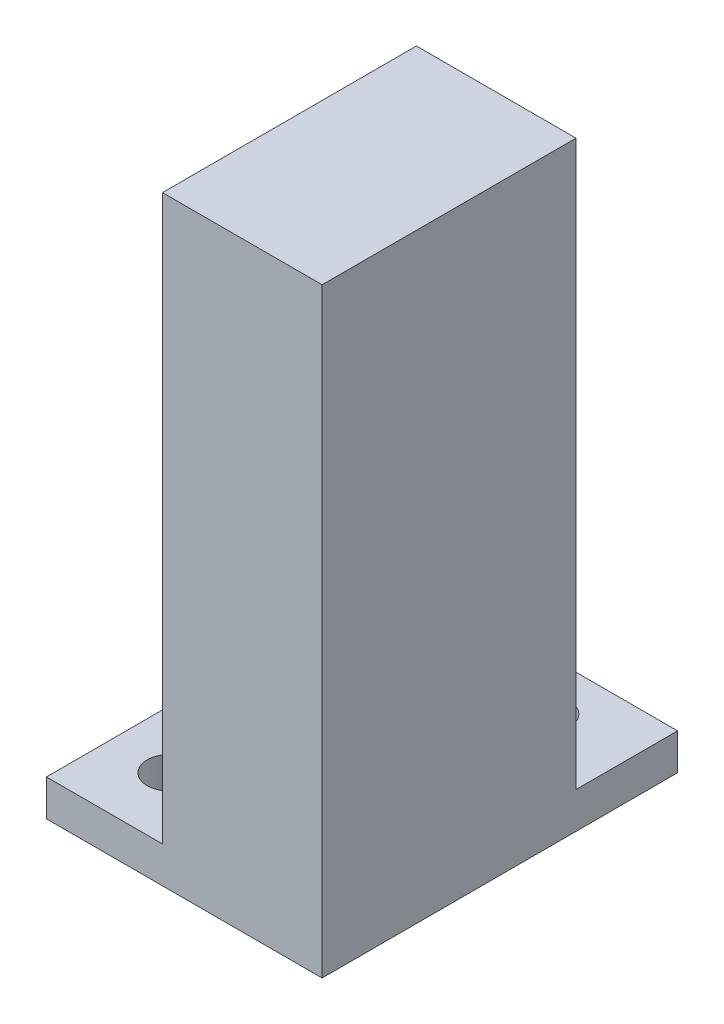
ISO-10303-21;
HEADER;
FILE_DESCRIPTION(('STEP AP214'),'2;1');
FILE_NAME('part.step','',(''),(''),'','','');
FILE_SCHEMA(('AUTOMOTIVE_DESIGN { 1 0 10303 214 1 1 1 1 }'));
ENDSEC;
DATA;
#1=APPLICATION_CONTEXT('core data for automotive mechanical design processes');
#2=APPLICATION_PROTOCOL_DEFINITION('international standard','automotive_design',2000,#1);
#3=PRODUCT_CONTEXT('',#1,'mechanical');
#4=PRODUCT('Part','Part','',(#3));
#5=PRODUCT_RELATED_PRODUCT_CATEGORY('part','',(#4));
#6=PRODUCT_DEFINITION_FORMATION('','',#4);
#7=PRODUCT_DEFINITION_CONTEXT('part definition',#1,'design');
#8=PRODUCT_DEFINITION('design','',#6,#7);
#9=PRODUCT_DEFINITION_SHAPE('','',#8);
#10=(LENGTH_UNIT() NAMED_UNIT(*) SI_UNIT(.MILLI.,.METRE.));
#11=(NAMED_UNIT(*) PLANE_ANGLE_UNIT() SI_UNIT($,.RADIAN.));
#12=(NAMED_UNIT(*) SI_UNIT($,.STERADIAN.) SOLID_ANGLE_UNIT());
#13=UNCERTAINTY_MEASURE_WITH_UNIT(LENGTH_MEASURE(1.E-05),#10,'distance_accuracy_value','');
#14=(GEOMETRIC_REPRESENTATION_CONTEXT(3) GLOBAL_UNCERTAINTY_ASSIGNED_CONTEXT((#13)) GLOBAL_UNIT_ASSIGNED_CONTEXT((#10,
#11,#12)) REPRESENTATION_CONTEXT('',''));
#15=CARTESIAN_POINT('',(0.,0.,0.));
#16=DIRECTION('',(0.,0.,1.));
#17=DIRECTION('',(1.,0.,0.));
#18=AXIS2_PLACEMENT_3D('',#15,#16,#17);
#19=CARTESIAN_POINT('',(0.,0.,0.));
#20=DIRECTION('',(0.,0.,1.));
#21=DIRECTION('',(1.,0.,0.));
#22=AXIS2_PLACEMENT_3D('',#19,#20,#21);
#23=PLANE('',#22);
#24=CARTESIAN_POINT('',(0.,35.7196543089587,0.));
#25=DIRECTION('',(0.,0.,1.));
#26=DIRECTION('',(1.,0.,0.));
#27=AXIS2_PLACEMENT_3D('',#24,#25,#26);
#28=CIRCLE('',#27,3.1);
#29=CARTESIAN_POINT('',(3.09999999999999,35.7196543089587,0.));
#30=VERTEX_POINT('',#29);
#31=EDGE_CURVE('E221',#30,#30,#28,.T.);
#32=ORIENTED_EDGE('',*,*,#31,.T.);
#33=EDGE_LOOP('',(#32));
#34=FACE_BOUND('',#33,.T.);
#35=CARTESIAN_POINT('',(0.,7.7196543089587,0.));
#36=DIRECTION('',(0.,0.,1.));
#37=DIRECTION('',(1.,0.,0.));
#38=AXIS2_PLACEMENT_3D('',#35,#36,#37);
#39=CIRCLE('',#38,3.1);
#40=CARTESIAN_POINT('',(3.1,7.7196543089587,0.));
#41=VERTEX_POINT('',#40);
#42=EDGE_CURVE('E217',#41,#41,#39,.T.);
#43=ORIENTED_EDGE('',*,*,#42,.T.);
#44=EDGE_LOOP('',(#43));
#45=FACE_BOUND('',#44,.T.);
#46=DIRECTION('',(1.,0.,0.));
#47=VECTOR('',#46,1.);
#48=CARTESIAN_POINT('',(0.,-28.5303456910413,0.));
#49=LINE('',#48,#47);
#50=CARTESIAN_POINT('',(-11.,-28.5303456910413,0.));
#51=VERTEX_POINT('',#50);
#52=CARTESIAN_POINT('',(11.,-28.5303456910413,0.));
#53=VERTEX_POINT('',#52);
#54=EDGE_CURVE('E132',#51,#53,#49,.T.);
#55=ORIENTED_EDGE('',*,*,#54,.F.);
#56=DIRECTION('',(0.,-1.,0.));
#57=VECTOR('',#56,1.);
#58=CARTESIAN_POINT('',(-11.,49.2196543089587,0.));
#59=LINE('',#58,#57);
#60=CARTESIAN_POINT('',(-11.,49.2196543089587,0.));
#61=VERTEX_POINT('',#60);
#62=EDGE_CURVE('E229',#61,#51,#59,.T.);
#63=ORIENTED_EDGE('',*,*,#62,.F.);
#64=DIRECTION('',(-1.,0.,0.));
#65=VECTOR('',#64,1.);
#66=CARTESIAN_POINT('',(11.,49.2196543089587,0.));
#67=LINE('',#66,#65);
#68=CARTESIAN_POINT('',(11.,49.2196543089587,0.));
#69=VERTEX_POINT('',#68);
#70=EDGE_CURVE('E225',#69,#61,#67,.T.);
#71=ORIENTED_EDGE('',*,*,#70,.F.);
#72=DIRECTION('',(0.,1.,0.));
#73=VECTOR('',#72,1.);
#74=CARTESIAN_POINT('',(11.,49.2196543089587,0.));
#75=LINE('',#74,#73);
#76=EDGE_CURVE('E234',#53,#69,#75,.T.);
#77=ORIENTED_EDGE('',*,*,#76,.F.);
#78=EDGE_LOOP('',(#55,#63,#71,#77));
#79=FACE_BOUND('',#78,.T.);
#80=ADVANCED_FACE('F45',(#34,#45,#79),#23,.F.);
#81=CARTESIAN_POINT('',(-11.,49.2196543089587,30.));
#82=DIRECTION('',(1.,0.,0.));
#83=DIRECTION('',(0.,0.,-1.));
#84=AXIS2_PLACEMENT_3D('',#81,#82,#83);
#85=PLANE('',#84);
#86=DIRECTION('',(0.,0.,-1.));
#87=VECTOR('',#86,1.);
#88=CARTESIAN_POINT('',(-11.,-28.5303456910413,0.));
#89=LINE('',#88,#87);
#90=CARTESIAN_POINT('',(-11.,-28.5303456910413,35.));
#91=VERTEX_POINT('',#90);
#92=EDGE_CURVE('E69',#91,#51,#89,.T.);
#93=ORIENTED_EDGE('',*,*,#92,.F.);
#94=DIRECTION('',(0.,-1.,0.));
#95=VECTOR('',#94,1.);
#96=CARTESIAN_POINT('',(-11.,49.2196543089587,35.));
#97=LINE('',#96,#95);
#98=CARTESIAN_POINT('',(-11.,49.2196543089587,35.));
#99=VERTEX_POINT('',#98);
#100=EDGE_CURVE('E199',#99,#91,#97,.T.);
#101=ORIENTED_EDGE('',*,*,#100,.F.);
#102=DIRECTION('',(0.,0.,-1.));
#103=VECTOR('',#102,1.);
#104=CARTESIAN_POINT('',(-11.,49.2196543089587,30.));
#105=LINE('',#104,#103);
#106=EDGE_CURVE('E244',#99,#61,#105,.T.);
#107=ORIENTED_EDGE('',*,*,#106,.T.);
#108=ORIENTED_EDGE('',*,*,#62,.T.);
#109=EDGE_LOOP('',(#93,#101,#107,#108));
#110=FACE_BOUND('',#109,.T.);
#111=ADVANCED_FACE('F263',(#110),#85,.F.);
#112=DIRECTION('',(-1.,0.,0.));
#113=VECTOR('',#112,1.);
#114=CARTESIAN_POINT('',(0.,-28.5303456910413,0.));
#115=LINE('',#114,#113);
#116=CARTESIAN_POINT('',(-27.,-28.5303456910413,0.));
#117=VERTEX_POINT('',#116);
#118=EDGE_CURVE('E183',#51,#117,#115,.T.);
#119=ORIENTED_EDGE('',*,*,#118,.F.);
#120=DIRECTION('',(0.,-1.,0.));
#121=VECTOR('',#120,1.);
#122=CARTESIAN_POINT('',(-11.,-28.5303456910413,0.));
#123=LINE('',#122,#121);
#124=CARTESIAN_POINT('',(-11.,-33.5303456910413,0.));
#125=VERTEX_POINT('',#124);
#126=EDGE_CURVE('E123',#51,#125,#123,.T.);
#127=ORIENTED_EDGE('',*,*,#126,.T.);
#128=DIRECTION('',(1.,0.,0.));
#129=VECTOR('',#128,1.);
#130=CARTESIAN_POINT('',(-11.,-33.5303456910413,0.));
#131=LINE('',#130,#129);
#132=CARTESIAN_POINT('',(-27.,-33.5303456910413,0.));
#133=VERTEX_POINT('',#132);
#134=EDGE_CURVE('E138',#133,#125,#131,.T.);
#135=ORIENTED_EDGE('',*,*,#134,.F.);
#136=DIRECTION('',(0.,-1.,0.));
#137=VECTOR('',#136,1.);
#138=CARTESIAN_POINT('',(-27.,-28.5303456910413,0.));
#139=LINE('',#138,#137);
#140=EDGE_CURVE('E195',#117,#133,#139,.T.);
#141=ORIENTED_EDGE('',*,*,#140,.F.);
#142=EDGE_LOOP('',(#119,#127,#135,#141));
#143=FACE_BOUND('',#142,.T.);
#144=ADVANCED_FACE('F266',(#143),#23,.F.);
#145=CARTESIAN_POINT('',(11.,49.2196543089587,30.));
#146=DIRECTION('',(0.,-1.,0.));
#147=DIRECTION('',(0.,0.,-1.));
#148=AXIS2_PLACEMENT_3D('',#145,#146,#147);
#149=PLANE('',#148);
#150=ORIENTED_EDGE('',*,*,#70,.T.);
#151=ORIENTED_EDGE('',*,*,#106,.F.);
#152=DIRECTION('',(-1.,0.,0.));
#153=VECTOR('',#152,1.);
#154=CARTESIAN_POINT('',(11.,49.2196543089587,35.));
#155=LINE('',#154,#153);
#156=CARTESIAN_POINT('',(11.,49.2196543089587,35.));
#157=VERTEX_POINT('',#156);
#158=EDGE_CURVE('E213',#157,#99,#155,.T.);
#159=ORIENTED_EDGE('',*,*,#158,.F.);
#160=DIRECTION('',(0.,0.,-1.));
#161=VECTOR('',#160,1.);
#162=CARTESIAN_POINT('',(11.,49.2196543089587,30.));
#163=LINE('',#162,#161);
#164=EDGE_CURVE('E237',#157,#69,#163,.T.);
#165=ORIENTED_EDGE('',*,*,#164,.T.);
#166=EDGE_LOOP('',(#150,#151,#159,#165));
#167=FACE_BOUND('',#166,.T.);
#168=ADVANCED_FACE('F47',(#167),#149,.F.);
#169=CARTESIAN_POINT('',(-11.,-33.5303456910413,30.));
#170=DIRECTION('',(0.,1.,0.));
#171=DIRECTION('',(0.,0.,1.));
#172=AXIS2_PLACEMENT_3D('',#169,#170,#171);
#173=PLANE('',#172);
#174=ORIENTED_EDGE('',*,*,#134,.T.);
#175=DIRECTION('',(0.,0.,-1.));
#176=VECTOR('',#175,1.);
#177=CARTESIAN_POINT('',(-11.,-33.5303456910413,0.));
#178=LINE('',#177,#176);
#179=CARTESIAN_POINT('',(-11.,-33.5303456910413,-14.));
#180=VERTEX_POINT('',#179);
#181=EDGE_CURVE('E61',#125,#180,#178,.T.);
#182=ORIENTED_EDGE('',*,*,#181,.T.);
#183=DIRECTION('',(1.,0.,0.));
#184=VECTOR('',#183,1.);
#185=CARTESIAN_POINT('',(0.,-33.5303456910413,-14.));
#186=LINE('',#185,#184);
#187=CARTESIAN_POINT('',(11.,-33.5303456910413,-14.));
#188=VERTEX_POINT('',#187);
#189=EDGE_CURVE('E127',#180,#188,#186,.T.);
#190=ORIENTED_EDGE('',*,*,#189,.T.);
#191=DIRECTION('',(0.,0.,-1.));
#192=VECTOR('',#191,1.);
#193=CARTESIAN_POINT('',(11.,-33.5303456910413,30.));
#194=LINE('',#193,#192);
#195=CARTESIAN_POINT('',(11.,-33.5303456910413,35.));
#196=VERTEX_POINT('',#195);
#197=EDGE_CURVE('E241',#196,#188,#194,.T.);
#198=ORIENTED_EDGE('',*,*,#197,.F.);
#199=DIRECTION('',(1.,0.,0.));
#200=VECTOR('',#199,1.);
#201=CARTESIAN_POINT('',(-11.,-33.5303456910413,35.));
#202=LINE('',#201,#200);
#203=CARTESIAN_POINT('',(-27.,-33.5303456910413,35.));
#204=VERTEX_POINT('',#203);
#205=EDGE_CURVE('E205',#204,#196,#202,.T.);
#206=ORIENTED_EDGE('',*,*,#205,.F.);
#207=DIRECTION('',(0.,0.,1.));
#208=VECTOR('',#207,1.);
#209=CARTESIAN_POINT('',(-27.,-33.5303456910413,0.));
#210=LINE('',#209,#208);
#211=EDGE_CURVE('E172',#133,#204,#210,.T.);
#212=ORIENTED_EDGE('',*,*,#211,.F.);
#213=EDGE_LOOP('',(#174,#182,#190,#198,#206,#212));
#214=FACE_BOUND('',#213,.T.);
#215=CARTESIAN_POINT('',(-19.,-33.5303456910413,26.));
#216=DIRECTION('',(0.,-1.,0.));
#217=DIRECTION('',(0.,0.,-1.));
#218=AXIS2_PLACEMENT_3D('',#215,#216,#217);
#219=CIRCLE('',#218,3.1);
#220=CARTESIAN_POINT('',(-19.,-33.5303456910413,22.9));
#221=VERTEX_POINT('',#220);
#222=EDGE_CURVE('E140',#221,#221,#219,.T.);
#223=ORIENTED_EDGE('',*,*,#222,.F.);
#224=EDGE_LOOP('',(#223));
#225=FACE_BOUND('',#224,.T.);
#226=CARTESIAN_POINT('',(-19.,-33.5303456910413,9.));
#227=DIRECTION('',(0.,-1.,0.));
#228=DIRECTION('',(0.,0.,-1.));
#229=AXIS2_PLACEMENT_3D('',#226,#227,#228);
#230=CIRCLE('',#229,3.1);
#231=CARTESIAN_POINT('',(-19.,-33.5303456910413,5.9));
#232=VERTEX_POINT('',#231);
#233=EDGE_CURVE('E144',#232,#232,#230,.T.);
#234=ORIENTED_EDGE('',*,*,#233,.F.);
#235=EDGE_LOOP('',(#234));
#236=FACE_BOUND('',#235,.T.);
#237=CARTESIAN_POINT('',(0.,-33.5303456910413,-7.));
#238=DIRECTION('',(0.,-1.,0.));
#239=DIRECTION('',(0.,0.,-1.));
#240=AXIS2_PLACEMENT_3D('',#237,#238,#239);
#241=CIRCLE('',#240,3.1);
#242=CARTESIAN_POINT('',(0.,-33.5303456910413,-10.1));
#243=VERTEX_POINT('',#242);
#244=EDGE_CURVE('E148',#243,#243,#241,.T.);
#245=ORIENTED_EDGE('',*,*,#244,.F.);
#246=EDGE_LOOP('',(#245));
#247=FACE_BOUND('',#246,.T.);
#248=ADVANCED_FACE('F135',(#214,#225,#236,#247),#173,.F.);
#249=CARTESIAN_POINT('',(11.,49.2196543089587,30.));
#250=DIRECTION('',(-1.,0.,0.));
#251=DIRECTION('',(0.,0.,1.));
#252=AXIS2_PLACEMENT_3D('',#249,#250,#251);
#253=PLANE('',#252);
#254=ORIENTED_EDGE('',*,*,#197,.T.);
#255=DIRECTION('',(0.,-1.,0.));
#256=VECTOR('',#255,1.);
#257=CARTESIAN_POINT('',(11.,-28.5303456910413,-14.));
#258=LINE('',#257,#256);
#259=CARTESIAN_POINT('',(11.,-28.5303456910413,-14.));
#260=VERTEX_POINT('',#259);
#261=EDGE_CURVE('E129',#260,#188,#258,.T.);
#262=ORIENTED_EDGE('',*,*,#261,.F.);
#263=DIRECTION('',(0.,0.,1.));
#264=VECTOR('',#263,1.);
#265=CARTESIAN_POINT('',(11.,-28.5303456910413,0.));
#266=LINE('',#265,#264);
#267=EDGE_CURVE('E152',#260,#53,#266,.T.);
#268=ORIENTED_EDGE('',*,*,#267,.T.);
#269=ORIENTED_EDGE('',*,*,#76,.T.);
#270=ORIENTED_EDGE('',*,*,#164,.F.);
#271=DIRECTION('',(0.,1.,0.));
#272=VECTOR('',#271,1.);
#273=CARTESIAN_POINT('',(11.,-33.5303456910413,35.));
#274=LINE('',#273,#272);
#275=EDGE_CURVE('E209',#196,#157,#274,.T.);
#276=ORIENTED_EDGE('',*,*,#275,.F.);
#277=EDGE_LOOP('',(#254,#262,#268,#269,#270,#276));
#278=FACE_BOUND('',#277,.T.);
#279=ADVANCED_FACE('F287',(#278),#253,.F.);
#280=CARTESIAN_POINT('',(0.,35.7196543089587,30.));
#281=DIRECTION('',(0.,0.,-1.));
#282=DIRECTION('',(-1.,0.,0.));
#283=AXIS2_PLACEMENT_3D('',#280,#281,#282);
#284=CYLINDRICAL_SURFACE('',#283,3.1);
#285=CARTESIAN_POINT('',(0.,35.7196543089587,15.));
#286=DIRECTION('',(0.,0.,-1.));
#287=DIRECTION('',(-1.,0.,0.));
#288=AXIS2_PLACEMENT_3D('',#285,#286,#287);
#289=CIRCLE('',#288,3.1);
#290=CARTESIAN_POINT('',(-3.10000000000001,35.7196543089587,15.));
#291=VERTEX_POINT('',#290);
#292=EDGE_CURVE('E11',#291,#291,#289,.T.);
#293=ORIENTED_EDGE('',*,*,#292,.F.);
#294=EDGE_LOOP('',(#293));
#295=FACE_BOUND('',#294,.T.);
#296=ORIENTED_EDGE('',*,*,#31,.F.);
#297=EDGE_LOOP('',(#296));
#298=FACE_BOUND('',#297,.T.);
#299=ADVANCED_FACE('F257',(#295,#298),#284,.F.);
#300=CARTESIAN_POINT('',(0.,7.7196543089587,30.));
#301=DIRECTION('',(0.,0.,-1.));
#302=DIRECTION('',(-1.,0.,0.));
#303=AXIS2_PLACEMENT_3D('',#300,#301,#302);
#304=CYLINDRICAL_SURFACE('',#303,3.1);
#305=CARTESIAN_POINT('',(0.,7.7196543089587,15.));
#306=DIRECTION('',(0.,0.,-1.));
#307=DIRECTION('',(-1.,0.,0.));
#308=AXIS2_PLACEMENT_3D('',#305,#306,#307);
#309=CIRCLE('',#308,3.1);
#310=CARTESIAN_POINT('',(-3.1,7.7196543089587,15.));
#311=VERTEX_POINT('',#310);
#312=EDGE_CURVE('E54',#311,#311,#309,.T.);
#313=ORIENTED_EDGE('',*,*,#312,.F.);
#314=EDGE_LOOP('',(#313));
#315=FACE_BOUND('',#314,.T.);
#316=ORIENTED_EDGE('',*,*,#42,.F.);
#317=EDGE_LOOP('',(#316));
#318=FACE_BOUND('',#317,.T.);
#319=ADVANCED_FACE('F253',(#315,#318),#304,.F.);
#320=CARTESIAN_POINT('',(0.,0.,35.));
#321=DIRECTION('',(0.,0.,1.));
#322=DIRECTION('',(1.,0.,0.));
#323=AXIS2_PLACEMENT_3D('',#320,#321,#322);
#324=PLANE('',#323);
#325=ORIENTED_EDGE('',*,*,#100,.T.);
#326=DIRECTION('',(1.,0.,0.));
#327=VECTOR('',#326,1.);
#328=CARTESIAN_POINT('',(0.,-28.5303456910413,35.));
#329=LINE('',#328,#327);
#330=CARTESIAN_POINT('',(-27.,-28.5303456910413,35.));
#331=VERTEX_POINT('',#330);
#332=EDGE_CURVE('E176',#331,#91,#329,.T.);
#333=ORIENTED_EDGE('',*,*,#332,.F.);
#334=DIRECTION('',(0.,-1.,0.));
#335=VECTOR('',#334,1.);
#336=CARTESIAN_POINT('',(-27.,-28.5303456910413,35.));
#337=LINE('',#336,#335);
#338=EDGE_CURVE('E187',#331,#204,#337,.T.);
#339=ORIENTED_EDGE('',*,*,#338,.T.);
#340=ORIENTED_EDGE('',*,*,#205,.T.);
#341=ORIENTED_EDGE('',*,*,#275,.T.);
#342=ORIENTED_EDGE('',*,*,#158,.T.);
#343=EDGE_LOOP('',(#325,#333,#339,#340,#341,#342));
#344=FACE_BOUND('',#343,.T.);
#345=ADVANCED_FACE('F256',(#344),#324,.T.);
#346=CARTESIAN_POINT('',(-19.,-28.5303456910413,9.));
#347=DIRECTION('',(0.,-1.,0.));
#348=DIRECTION('',(0.,0.,-1.));
#349=AXIS2_PLACEMENT_3D('',#346,#347,#348);
#350=CYLINDRICAL_SURFACE('',#349,3.1);
#351=CARTESIAN_POINT('',(-19.,-28.5303456910413,9.));
#352=DIRECTION('',(0.,-1.,0.));
#353=DIRECTION('',(0.,0.,-1.));
#354=AXIS2_PLACEMENT_3D('',#351,#352,#353);
#355=CIRCLE('',#354,3.1);
#356=CARTESIAN_POINT('',(-19.,-28.5303456910413,5.9));
#357=VERTEX_POINT('',#356);
#358=EDGE_CURVE('E171',#357,#357,#355,.T.);
#359=ORIENTED_EDGE('',*,*,#358,.F.);
#360=EDGE_LOOP('',(#359));
#361=FACE_BOUND('',#360,.T.);
#362=ORIENTED_EDGE('',*,*,#233,.T.);
#363=EDGE_LOOP('',(#362));
#364=FACE_BOUND('',#363,.T.);
#365=ADVANCED_FACE('F310',(#361,#364),#350,.F.);
#366=CARTESIAN_POINT('',(-19.,-28.5303456910413,26.));
#367=DIRECTION('',(0.,-1.,0.));
#368=DIRECTION('',(0.,0.,-1.));
#369=AXIS2_PLACEMENT_3D('',#366,#367,#368);
#370=CYLINDRICAL_SURFACE('',#369,3.1);
#371=CARTESIAN_POINT('',(-19.,-28.5303456910413,26.));
#372=DIRECTION('',(0.,-1.,0.));
#373=DIRECTION('',(0.,0.,-1.));
#374=AXIS2_PLACEMENT_3D('',#371,#372,#373);
#375=CIRCLE('',#374,3.1);
#376=CARTESIAN_POINT('',(-19.,-28.5303456910413,22.9));
#377=VERTEX_POINT('',#376);
#378=EDGE_CURVE('E167',#377,#377,#375,.T.);
#379=ORIENTED_EDGE('',*,*,#378,.F.);
#380=EDGE_LOOP('',(#379));
#381=FACE_BOUND('',#380,.T.);
#382=ORIENTED_EDGE('',*,*,#222,.T.);
#383=EDGE_LOOP('',(#382));
#384=FACE_BOUND('',#383,.T.);
#385=ADVANCED_FACE('F309',(#381,#384),#370,.F.);
#386=CARTESIAN_POINT('',(-27.,-28.5303456910413,0.));
#387=DIRECTION('',(1.,0.,0.));
#388=DIRECTION('',(0.,0.,-1.));
#389=AXIS2_PLACEMENT_3D('',#386,#387,#388);
#390=PLANE('',#389);
#391=ORIENTED_EDGE('',*,*,#211,.T.);
#392=ORIENTED_EDGE('',*,*,#338,.F.);
#393=DIRECTION('',(0.,0.,1.));
#394=VECTOR('',#393,1.);
#395=CARTESIAN_POINT('',(-27.,-28.5303456910413,0.));
#396=LINE('',#395,#394);
#397=EDGE_CURVE('E180',#117,#331,#396,.T.);
#398=ORIENTED_EDGE('',*,*,#397,.F.);
#399=ORIENTED_EDGE('',*,*,#140,.T.);
#400=EDGE_LOOP('',(#391,#392,#398,#399));
#401=FACE_BOUND('',#400,.T.);
#402=ADVANCED_FACE('F281',(#401),#390,.F.);
#403=CARTESIAN_POINT('',(0.,-28.5303456910413,0.));
#404=DIRECTION('',(0.,-1.,0.));
#405=DIRECTION('',(0.,0.,-1.));
#406=AXIS2_PLACEMENT_3D('',#403,#404,#405);
#407=PLANE('',#406);
#408=ORIENTED_EDGE('',*,*,#378,.T.);
#409=EDGE_LOOP('',(#408));
#410=FACE_BOUND('',#409,.T.);
#411=ORIENTED_EDGE('',*,*,#358,.T.);
#412=EDGE_LOOP('',(#411));
#413=FACE_BOUND('',#412,.T.);
#414=ORIENTED_EDGE('',*,*,#332,.T.);
#415=ORIENTED_EDGE('',*,*,#92,.T.);
#416=ORIENTED_EDGE('',*,*,#118,.T.);
#417=ORIENTED_EDGE('',*,*,#397,.T.);
#418=EDGE_LOOP('',(#414,#415,#416,#417));
#419=FACE_BOUND('',#418,.T.);
#420=ADVANCED_FACE('F274',(#410,#413,#419),#407,.F.);
#421=CARTESIAN_POINT('',(0.,-28.5303456910413,-14.));
#422=DIRECTION('',(0.,0.,-1.));
#423=DIRECTION('',(-1.,0.,0.));
#424=AXIS2_PLACEMENT_3D('',#421,#422,#423);
#425=PLANE('',#424);
#426=ORIENTED_EDGE('',*,*,#189,.F.);
#427=DIRECTION('',(0.,-1.,0.));
#428=VECTOR('',#427,1.);
#429=CARTESIAN_POINT('',(-11.,-28.5303456910413,-14.));
#430=LINE('',#429,#428);
#431=CARTESIAN_POINT('',(-11.,-28.5303456910413,-14.));
#432=VERTEX_POINT('',#431);
#433=EDGE_CURVE('E114',#432,#180,#430,.T.);
#434=ORIENTED_EDGE('',*,*,#433,.F.);
#435=DIRECTION('',(1.,0.,0.));
#436=VECTOR('',#435,1.);
#437=CARTESIAN_POINT('',(0.,-28.5303456910413,-14.));
#438=LINE('',#437,#436);
#439=EDGE_CURVE('E161',#432,#260,#438,.T.);
#440=ORIENTED_EDGE('',*,*,#439,.T.);
#441=ORIENTED_EDGE('',*,*,#261,.T.);
#442=EDGE_LOOP('',(#426,#434,#440,#441));
#443=FACE_BOUND('',#442,.T.);
#444=ADVANCED_FACE('F128',(#443),#425,.T.);
#445=CARTESIAN_POINT('',(-11.,-28.5303456910413,0.));
#446=DIRECTION('',(-1.,0.,0.));
#447=DIRECTION('',(0.,0.,1.));
#448=AXIS2_PLACEMENT_3D('',#445,#446,#447);
#449=PLANE('',#448);
#450=ORIENTED_EDGE('',*,*,#181,.F.);
#451=ORIENTED_EDGE('',*,*,#126,.F.);
#452=DIRECTION('',(0.,0.,-1.));
#453=VECTOR('',#452,1.);
#454=CARTESIAN_POINT('',(-11.,-28.5303456910413,0.));
#455=LINE('',#454,#453);
#456=EDGE_CURVE('E118',#51,#432,#455,.T.);
#457=ORIENTED_EDGE('',*,*,#456,.T.);
#458=ORIENTED_EDGE('',*,*,#433,.T.);
#459=EDGE_LOOP('',(#450,#451,#457,#458));
#460=FACE_BOUND('',#459,.T.);
#461=ADVANCED_FACE('F116',(#460),#449,.T.);
#462=CARTESIAN_POINT('',(0.,-28.5303456910413,-7.));
#463=DIRECTION('',(0.,-1.,0.));
#464=DIRECTION('',(0.,0.,-1.));
#465=AXIS2_PLACEMENT_3D('',#462,#463,#464);
#466=CYLINDRICAL_SURFACE('',#465,3.1);
#467=CARTESIAN_POINT('',(0.,-28.5303456910413,-7.));
#468=DIRECTION('',(0.,-1.,0.));
#469=DIRECTION('',(0.,0.,-1.));
#470=AXIS2_PLACEMENT_3D('',#467,#468,#469);
#471=CIRCLE('',#470,3.1);
#472=CARTESIAN_POINT('',(0.,-28.5303456910413,-10.1));
#473=VERTEX_POINT('',#472);
#474=EDGE_CURVE('E157',#473,#473,#471,.T.);
#475=ORIENTED_EDGE('',*,*,#474,.F.);
#476=EDGE_LOOP('',(#475));
#477=FACE_BOUND('',#476,.T.);
#478=ORIENTED_EDGE('',*,*,#244,.T.);
#479=EDGE_LOOP('',(#478));
#480=FACE_BOUND('',#479,.T.);
#481=ADVANCED_FACE('F290',(#477,#480),#466,.F.);
#482=CARTESIAN_POINT('',(0.,-28.5303456910413,0.));
#483=DIRECTION('',(0.,-1.,0.));
#484=DIRECTION('',(0.,0.,-1.));
#485=AXIS2_PLACEMENT_3D('',#482,#483,#484);
#486=PLANE('',#485);
#487=ORIENTED_EDGE('',*,*,#474,.T.);
#488=EDGE_LOOP('',(#487));
#489=FACE_BOUND('',#488,.T.);
#490=ORIENTED_EDGE('',*,*,#439,.F.);
#491=ORIENTED_EDGE('',*,*,#456,.F.);
#492=ORIENTED_EDGE('',*,*,#54,.T.);
#493=ORIENTED_EDGE('',*,*,#267,.F.);
#494=EDGE_LOOP('',(#490,#491,#492,#493));
#495=FACE_BOUND('',#494,.T.);
#496=ADVANCED_FACE('F288',(#489,#495),#486,.F.);
#497=CARTESIAN_POINT('',(0.,7.7196543089587,15.));
#498=DIRECTION('',(0.,0.,-1.));
#499=DIRECTION('',(-1.,0.,0.));
#500=AXIS2_PLACEMENT_3D('',#497,#498,#499);
#501=PLANE('',#500);
#502=ORIENTED_EDGE('',*,*,#312,.T.);
#503=EDGE_LOOP('',(#502));
#504=FACE_BOUND('',#503,.T.);
#505=ADVANCED_FACE('F251',(#504),#501,.T.);
#506=CARTESIAN_POINT('',(0.,35.7196543089587,15.));
#507=DIRECTION('',(0.,0.,-1.));
#508=DIRECTION('',(-1.,0.,0.));
#509=AXIS2_PLACEMENT_3D('',#506,#507,#508);
#510=PLANE('',#509);
#511=ORIENTED_EDGE('',*,*,#292,.T.);
#512=EDGE_LOOP('',(#511));
#513=FACE_BOUND('',#512,.T.);
#514=ADVANCED_FACE('F297',(#513),#510,.T.);
#515=CLOSED_SHELL('',(#80,#111,#144,#168,#248,#279,#299,#319,#345,#365,#385,#402,#420,#444,#461,
#481,#496,#505,#514));
#516=MANIFOLD_SOLID_BREP('B2',#515);
#517=ADVANCED_BREP_SHAPE_REPRESENTATION('',(#18,#516),#14);
#518=SHAPE_DEFINITION_REPRESENTATION(#9,#517);
ENDSEC;
END-ISO-10303-21;
